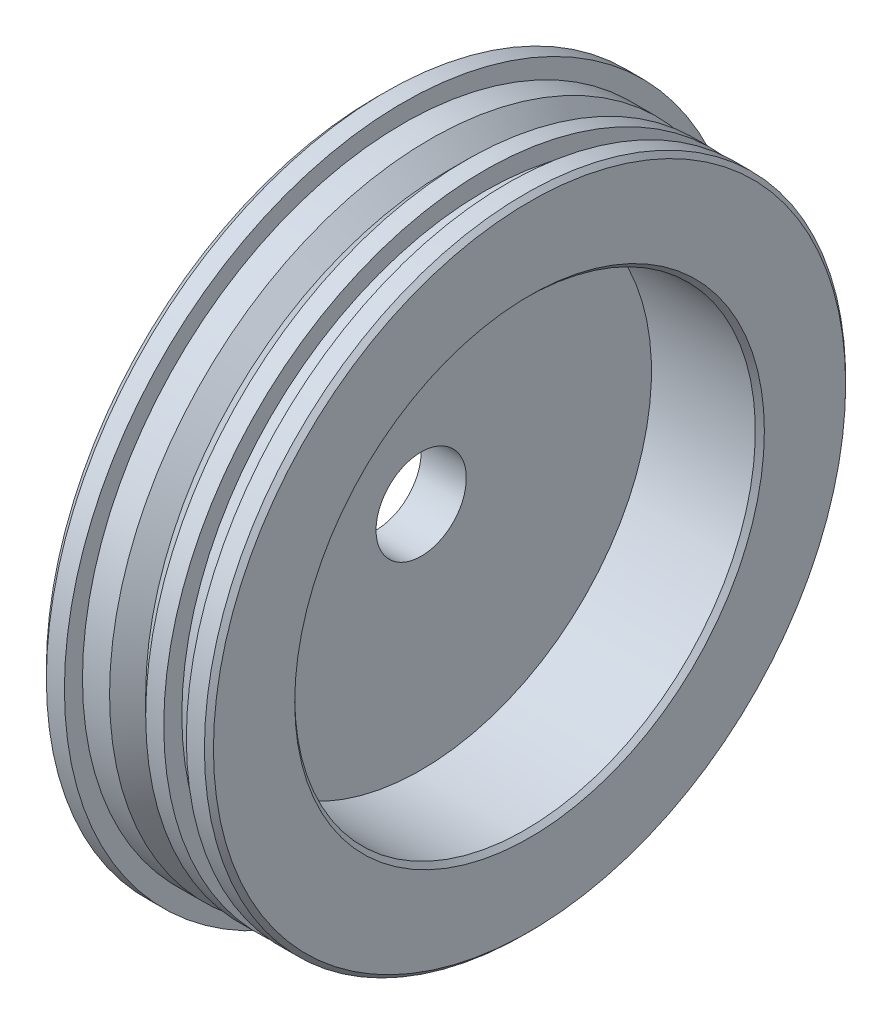
ISO-10303-21;
HEADER;
FILE_DESCRIPTION(('STEP AP214'),'2;1');
FILE_NAME('part.step','',(''),(''),'','','');
FILE_SCHEMA(('AUTOMOTIVE_DESIGN { 1 0 10303 214 1 1 1 1 }'));
ENDSEC;
DATA;
#1=APPLICATION_CONTEXT('core data for automotive mechanical design processes');
#2=APPLICATION_PROTOCOL_DEFINITION('international standard','automotive_design',2000,#1);
#3=PRODUCT_CONTEXT('',#1,'mechanical');
#4=PRODUCT('Part','Part','',(#3));
#5=PRODUCT_RELATED_PRODUCT_CATEGORY('part','',(#4));
#6=PRODUCT_DEFINITION_FORMATION('','',#4);
#7=PRODUCT_DEFINITION_CONTEXT('part definition',#1,'design');
#8=PRODUCT_DEFINITION('design','',#6,#7);
#9=PRODUCT_DEFINITION_SHAPE('','',#8);
#10=(LENGTH_UNIT() NAMED_UNIT(*) SI_UNIT(.MILLI.,.METRE.));
#11=(NAMED_UNIT(*) PLANE_ANGLE_UNIT() SI_UNIT($,.RADIAN.));
#12=(NAMED_UNIT(*) SI_UNIT($,.STERADIAN.) SOLID_ANGLE_UNIT());
#13=UNCERTAINTY_MEASURE_WITH_UNIT(LENGTH_MEASURE(1.E-05),#10,'distance_accuracy_value','');
#14=(GEOMETRIC_REPRESENTATION_CONTEXT(3) GLOBAL_UNCERTAINTY_ASSIGNED_CONTEXT((#13)) GLOBAL_UNIT_ASSIGNED_CONTEXT((#10,
#11,#12)) REPRESENTATION_CONTEXT('',''));
#15=CARTESIAN_POINT('',(0.,0.,0.));
#16=DIRECTION('',(0.,0.,1.));
#17=DIRECTION('',(1.,0.,0.));
#18=AXIS2_PLACEMENT_3D('',#15,#16,#17);
#19=CARTESIAN_POINT('',(-5.,0.,0.));
#20=DIRECTION('',(1.,0.,0.));
#21=DIRECTION('',(0.,0.,-1.));
#22=AXIS2_PLACEMENT_3D('',#19,#20,#21);
#23=PLANE('',#22);
#24=CARTESIAN_POINT('',(-5.,0.,0.));
#25=DIRECTION('',(-1.,0.,0.));
#26=DIRECTION('',(0.,0.,1.));
#27=AXIS2_PLACEMENT_3D('',#24,#25,#26);
#28=CIRCLE('',#27,5.);
#29=CARTESIAN_POINT('',(-5.,0.,5.));
#30=VERTEX_POINT('',#29);
#31=EDGE_CURVE('E92',#30,#30,#28,.T.);
#32=ORIENTED_EDGE('',*,*,#31,.F.);
#33=EDGE_LOOP('',(#32));
#34=FACE_BOUND('',#33,.T.);
#35=CARTESIAN_POINT('',(-5.,0.,0.));
#36=DIRECTION('',(-1.,0.,0.));
#37=DIRECTION('',(0.,0.,1.));
#38=AXIS2_PLACEMENT_3D('',#35,#36,#37);
#39=CIRCLE('',#38,36.5);
#40=CARTESIAN_POINT('',(-5.,0.,36.5));
#41=VERTEX_POINT('',#40);
#42=EDGE_CURVE('E10',#41,#41,#39,.T.);
#43=ORIENTED_EDGE('',*,*,#42,.T.);
#44=EDGE_LOOP('',(#43));
#45=FACE_BOUND('',#44,.T.);
#46=ADVANCED_FACE('F37',(#34,#45),#23,.F.);
#47=CARTESIAN_POINT('',(-4.,0.,0.));
#48=DIRECTION('',(1.,0.,0.));
#49=DIRECTION('',(0.,0.,-1.));
#50=AXIS2_PLACEMENT_3D('',#47,#48,#49);
#51=CONICAL_SURFACE('',#50,37.5,0.785398163397449);
#52=ORIENTED_EDGE('',*,*,#42,.F.);
#53=EDGE_LOOP('',(#52));
#54=FACE_BOUND('',#53,.T.);
#55=CARTESIAN_POINT('',(-4.,0.,0.));
#56=DIRECTION('',(-1.,0.,0.));
#57=DIRECTION('',(0.,0.,1.));
#58=AXIS2_PLACEMENT_3D('',#55,#56,#57);
#59=CIRCLE('',#58,37.5);
#60=CARTESIAN_POINT('',(-4.,0.,37.5));
#61=VERTEX_POINT('',#60);
#62=EDGE_CURVE('E44',#61,#61,#59,.T.);
#63=ORIENTED_EDGE('',*,*,#62,.T.);
#64=EDGE_LOOP('',(#63));
#65=FACE_BOUND('',#64,.T.);
#66=ADVANCED_FACE('F111',(#54,#65),#51,.T.);
#67=CARTESIAN_POINT('',(0.,0.,0.));
#68=DIRECTION('',(-1.,0.,0.));
#69=DIRECTION('',(0.,0.,1.));
#70=AXIS2_PLACEMENT_3D('',#67,#68,#69);
#71=CYLINDRICAL_SURFACE('',#70,37.5);
#72=ORIENTED_EDGE('',*,*,#62,.F.);
#73=EDGE_LOOP('',(#72));
#74=FACE_BOUND('',#73,.T.);
#75=CARTESIAN_POINT('',(-2.,0.,0.));
#76=DIRECTION('',(-1.,0.,0.));
#77=DIRECTION('',(0.,0.,1.));
#78=AXIS2_PLACEMENT_3D('',#75,#76,#77);
#79=CIRCLE('',#78,37.5);
#80=CARTESIAN_POINT('',(-2.,0.,37.5));
#81=VERTEX_POINT('',#80);
#82=EDGE_CURVE('E48',#81,#81,#79,.T.);
#83=ORIENTED_EDGE('',*,*,#82,.T.);
#84=EDGE_LOOP('',(#83));
#85=FACE_BOUND('',#84,.T.);
#86=ADVANCED_FACE('F116',(#74,#85),#71,.T.);
#87=CARTESIAN_POINT('',(-2.,37.5,0.));
#88=DIRECTION('',(-1.,0.,0.));
#89=DIRECTION('',(0.,0.,1.));
#90=AXIS2_PLACEMENT_3D('',#87,#88,#89);
#91=PLANE('',#90);
#92=ORIENTED_EDGE('',*,*,#82,.F.);
#93=EDGE_LOOP('',(#92));
#94=FACE_BOUND('',#93,.T.);
#95=CARTESIAN_POINT('',(-2.,0.,0.));
#96=DIRECTION('',(-1.,0.,0.));
#97=DIRECTION('',(0.,0.,1.));
#98=AXIS2_PLACEMENT_3D('',#95,#96,#97);
#99=CIRCLE('',#98,35.5);
#100=CARTESIAN_POINT('',(-2.,0.,35.5));
#101=VERTEX_POINT('',#100);
#102=EDGE_CURVE('E53',#101,#101,#99,.T.);
#103=ORIENTED_EDGE('',*,*,#102,.T.);
#104=EDGE_LOOP('',(#103));
#105=FACE_BOUND('',#104,.T.);
#106=ADVANCED_FACE('F121',(#94,#105),#91,.F.);
#107=CARTESIAN_POINT('',(0.,0.,0.));
#108=DIRECTION('',(-1.,0.,0.));
#109=DIRECTION('',(0.,0.,1.));
#110=AXIS2_PLACEMENT_3D('',#107,#108,#109);
#111=CYLINDRICAL_SURFACE('',#110,35.5);
#112=ORIENTED_EDGE('',*,*,#102,.F.);
#113=EDGE_LOOP('',(#112));
#114=FACE_BOUND('',#113,.T.);
#115=CARTESIAN_POINT('',(1.00000000000001,0.,0.));
#116=DIRECTION('',(-1.,0.,0.));
#117=DIRECTION('',(0.,0.,1.));
#118=AXIS2_PLACEMENT_3D('',#115,#116,#117);
#119=CIRCLE('',#118,35.5);
#120=CARTESIAN_POINT('',(1.00000000000001,0.,35.5));
#121=VERTEX_POINT('',#120);
#122=EDGE_CURVE('E56',#121,#121,#119,.T.);
#123=ORIENTED_EDGE('',*,*,#122,.T.);
#124=EDGE_LOOP('',(#123));
#125=FACE_BOUND('',#124,.T.);
#126=ADVANCED_FACE('F128',(#114,#125),#111,.T.);
#127=CARTESIAN_POINT('',(3.,0.,0.));
#128=DIRECTION('',(-1.,0.,0.));
#129=DIRECTION('',(0.,0.,1.));
#130=AXIS2_PLACEMENT_3D('',#127,#128,#129);
#131=CONICAL_SURFACE('',#130,33.5,0.785398163397451);
#132=ORIENTED_EDGE('',*,*,#122,.F.);
#133=EDGE_LOOP('',(#132));
#134=FACE_BOUND('',#133,.T.);
#135=CARTESIAN_POINT('',(3.,0.,0.));
#136=DIRECTION('',(-1.,0.,0.));
#137=DIRECTION('',(0.,0.,1.));
#138=AXIS2_PLACEMENT_3D('',#135,#136,#137);
#139=CIRCLE('',#138,33.5);
#140=CARTESIAN_POINT('',(3.,0.,33.5));
#141=VERTEX_POINT('',#140);
#142=EDGE_CURVE('E59',#141,#141,#139,.T.);
#143=ORIENTED_EDGE('',*,*,#142,.T.);
#144=EDGE_LOOP('',(#143));
#145=FACE_BOUND('',#144,.T.);
#146=ADVANCED_FACE('F132',(#134,#145),#131,.T.);
#147=CARTESIAN_POINT('',(5.00000000000001,0.,0.));
#148=DIRECTION('',(1.,0.,0.));
#149=DIRECTION('',(0.,0.,-1.));
#150=AXIS2_PLACEMENT_3D('',#147,#148,#149);
#151=CONICAL_SURFACE('',#150,35.5,0.785398163397446);
#152=ORIENTED_EDGE('',*,*,#142,.F.);
#153=EDGE_LOOP('',(#152));
#154=FACE_BOUND('',#153,.T.);
#155=CARTESIAN_POINT('',(5.00000000000001,0.,0.));
#156=DIRECTION('',(-1.,0.,0.));
#157=DIRECTION('',(0.,0.,1.));
#158=AXIS2_PLACEMENT_3D('',#155,#156,#157);
#159=CIRCLE('',#158,35.5);
#160=CARTESIAN_POINT('',(5.00000000000001,0.,35.5));
#161=VERTEX_POINT('',#160);
#162=EDGE_CURVE('E62',#161,#161,#159,.T.);
#163=ORIENTED_EDGE('',*,*,#162,.T.);
#164=EDGE_LOOP('',(#163));
#165=FACE_BOUND('',#164,.T.);
#166=ADVANCED_FACE('F136',(#154,#165),#151,.T.);
#167=CARTESIAN_POINT('',(0.,0.,0.));
#168=DIRECTION('',(-1.,0.,0.));
#169=DIRECTION('',(0.,0.,1.));
#170=AXIS2_PLACEMENT_3D('',#167,#168,#169);
#171=CYLINDRICAL_SURFACE('',#170,35.5);
#172=ORIENTED_EDGE('',*,*,#162,.F.);
#173=EDGE_LOOP('',(#172));
#174=FACE_BOUND('',#173,.T.);
#175=CARTESIAN_POINT('',(7.00000000000001,0.,0.));
#176=DIRECTION('',(-1.,0.,0.));
#177=DIRECTION('',(0.,0.,1.));
#178=AXIS2_PLACEMENT_3D('',#175,#176,#177);
#179=CIRCLE('',#178,35.5);
#180=CARTESIAN_POINT('',(7.00000000000001,0.,35.5));
#181=VERTEX_POINT('',#180);
#182=EDGE_CURVE('E65',#181,#181,#179,.T.);
#183=ORIENTED_EDGE('',*,*,#182,.T.);
#184=EDGE_LOOP('',(#183));
#185=FACE_BOUND('',#184,.T.);
#186=ADVANCED_FACE('F140',(#174,#185),#171,.T.);
#187=CARTESIAN_POINT('',(7.00000000000001,35.5,0.));
#188=DIRECTION('',(-1.,0.,0.));
#189=DIRECTION('',(0.,0.,1.));
#190=AXIS2_PLACEMENT_3D('',#187,#188,#189);
#191=PLANE('',#190);
#192=ORIENTED_EDGE('',*,*,#182,.F.);
#193=EDGE_LOOP('',(#192));
#194=FACE_BOUND('',#193,.T.);
#195=CARTESIAN_POINT('',(7.00000000000001,0.,0.));
#196=DIRECTION('',(-1.,0.,0.));
#197=DIRECTION('',(0.,0.,1.));
#198=AXIS2_PLACEMENT_3D('',#195,#196,#197);
#199=CIRCLE('',#198,33.5);
#200=CARTESIAN_POINT('',(7.00000000000001,0.,33.5));
#201=VERTEX_POINT('',#200);
#202=EDGE_CURVE('E68',#201,#201,#199,.T.);
#203=ORIENTED_EDGE('',*,*,#202,.T.);
#204=EDGE_LOOP('',(#203));
#205=FACE_BOUND('',#204,.T.);
#206=ADVANCED_FACE('F144',(#194,#205),#191,.F.);
#207=CARTESIAN_POINT('',(0.,0.,0.));
#208=DIRECTION('',(-1.,0.,0.));
#209=DIRECTION('',(0.,0.,1.));
#210=AXIS2_PLACEMENT_3D('',#207,#208,#209);
#211=CYLINDRICAL_SURFACE('',#210,33.5);
#212=ORIENTED_EDGE('',*,*,#202,.F.);
#213=EDGE_LOOP('',(#212));
#214=FACE_BOUND('',#213,.T.);
#215=CARTESIAN_POINT('',(9.50000000000001,0.,0.));
#216=DIRECTION('',(-1.,0.,0.));
#217=DIRECTION('',(0.,0.,1.));
#218=AXIS2_PLACEMENT_3D('',#215,#216,#217);
#219=CIRCLE('',#218,33.5);
#220=CARTESIAN_POINT('',(9.50000000000001,0.,33.5));
#221=VERTEX_POINT('',#220);
#222=EDGE_CURVE('E71',#221,#221,#219,.T.);
#223=ORIENTED_EDGE('',*,*,#222,.T.);
#224=EDGE_LOOP('',(#223));
#225=FACE_BOUND('',#224,.T.);
#226=ADVANCED_FACE('F148',(#214,#225),#211,.T.);
#227=CARTESIAN_POINT('',(9.50000000000001,33.5,0.));
#228=DIRECTION('',(1.,0.,0.));
#229=DIRECTION('',(0.,0.,-1.));
#230=AXIS2_PLACEMENT_3D('',#227,#228,#229);
#231=PLANE('',#230);
#232=ORIENTED_EDGE('',*,*,#222,.F.);
#233=EDGE_LOOP('',(#232));
#234=FACE_BOUND('',#233,.T.);
#235=CARTESIAN_POINT('',(9.50000000000001,0.,0.));
#236=DIRECTION('',(-1.,0.,0.));
#237=DIRECTION('',(0.,0.,1.));
#238=AXIS2_PLACEMENT_3D('',#235,#236,#237);
#239=CIRCLE('',#238,35.5);
#240=CARTESIAN_POINT('',(9.50000000000001,0.,35.5));
#241=VERTEX_POINT('',#240);
#242=EDGE_CURVE('E74',#241,#241,#239,.T.);
#243=ORIENTED_EDGE('',*,*,#242,.T.);
#244=EDGE_LOOP('',(#243));
#245=FACE_BOUND('',#244,.T.);
#246=ADVANCED_FACE('F152',(#234,#245),#231,.F.);
#247=CARTESIAN_POINT('',(0.,0.,0.));
#248=DIRECTION('',(-1.,0.,0.));
#249=DIRECTION('',(0.,0.,1.));
#250=AXIS2_PLACEMENT_3D('',#247,#248,#249);
#251=CYLINDRICAL_SURFACE('',#250,35.5);
#252=ORIENTED_EDGE('',*,*,#242,.F.);
#253=EDGE_LOOP('',(#252));
#254=FACE_BOUND('',#253,.T.);
#255=CARTESIAN_POINT('',(11.5,0.,0.));
#256=DIRECTION('',(-1.,0.,0.));
#257=DIRECTION('',(0.,0.,1.));
#258=AXIS2_PLACEMENT_3D('',#255,#256,#257);
#259=CIRCLE('',#258,35.5);
#260=CARTESIAN_POINT('',(11.5,0.,35.5));
#261=VERTEX_POINT('',#260);
#262=EDGE_CURVE('E77',#261,#261,#259,.T.);
#263=ORIENTED_EDGE('',*,*,#262,.T.);
#264=EDGE_LOOP('',(#263));
#265=FACE_BOUND('',#264,.T.);
#266=ADVANCED_FACE('F156',(#254,#265),#251,.T.);
#267=CARTESIAN_POINT('',(12.,0.,0.));
#268=DIRECTION('',(-1.,0.,0.));
#269=DIRECTION('',(0.,0.,1.));
#270=AXIS2_PLACEMENT_3D('',#267,#268,#269);
#271=CONICAL_SURFACE('',#270,35.,0.785398163397447);
#272=ORIENTED_EDGE('',*,*,#262,.F.);
#273=EDGE_LOOP('',(#272));
#274=FACE_BOUND('',#273,.T.);
#275=CARTESIAN_POINT('',(12.,0.,0.));
#276=DIRECTION('',(-1.,0.,0.));
#277=DIRECTION('',(0.,0.,1.));
#278=AXIS2_PLACEMENT_3D('',#275,#276,#277);
#279=CIRCLE('',#278,35.);
#280=CARTESIAN_POINT('',(12.,0.,35.));
#281=VERTEX_POINT('',#280);
#282=EDGE_CURVE('E80',#281,#281,#279,.T.);
#283=ORIENTED_EDGE('',*,*,#282,.T.);
#284=EDGE_LOOP('',(#283));
#285=FACE_BOUND('',#284,.T.);
#286=ADVANCED_FACE('F160',(#274,#285),#271,.T.);
#287=CARTESIAN_POINT('',(12.,35.,0.));
#288=DIRECTION('',(-1.,0.,0.));
#289=DIRECTION('',(0.,0.,1.));
#290=AXIS2_PLACEMENT_3D('',#287,#288,#289);
#291=PLANE('',#290);
#292=ORIENTED_EDGE('',*,*,#282,.F.);
#293=EDGE_LOOP('',(#292));
#294=FACE_BOUND('',#293,.T.);
#295=CARTESIAN_POINT('',(12.,0.,0.));
#296=DIRECTION('',(-1.,0.,0.));
#297=DIRECTION('',(0.,0.,1.));
#298=AXIS2_PLACEMENT_3D('',#295,#296,#297);
#299=CIRCLE('',#298,26.);
#300=CARTESIAN_POINT('',(12.,0.,26.));
#301=VERTEX_POINT('',#300);
#302=EDGE_CURVE('E83',#301,#301,#299,.T.);
#303=ORIENTED_EDGE('',*,*,#302,.T.);
#304=EDGE_LOOP('',(#303));
#305=FACE_BOUND('',#304,.T.);
#306=ADVANCED_FACE('F164',(#294,#305),#291,.F.);
#307=CARTESIAN_POINT('',(11.5,0.,0.));
#308=DIRECTION('',(1.,0.,0.));
#309=DIRECTION('',(0.,0.,-1.));
#310=AXIS2_PLACEMENT_3D('',#307,#308,#309);
#311=CONICAL_SURFACE('',#310,25.5,0.78539816339745);
#312=ORIENTED_EDGE('',*,*,#302,.F.);
#313=EDGE_LOOP('',(#312));
#314=FACE_BOUND('',#313,.T.);
#315=CARTESIAN_POINT('',(11.5,0.,0.));
#316=DIRECTION('',(-1.,0.,0.));
#317=DIRECTION('',(0.,0.,1.));
#318=AXIS2_PLACEMENT_3D('',#315,#316,#317);
#319=CIRCLE('',#318,25.5);
#320=CARTESIAN_POINT('',(11.5,0.,25.5));
#321=VERTEX_POINT('',#320);
#322=EDGE_CURVE('E86',#321,#321,#319,.T.);
#323=ORIENTED_EDGE('',*,*,#322,.T.);
#324=EDGE_LOOP('',(#323));
#325=FACE_BOUND('',#324,.T.);
#326=ADVANCED_FACE('F168',(#314,#325),#311,.F.);
#327=CARTESIAN_POINT('',(0.,0.,0.));
#328=DIRECTION('',(-1.,0.,0.));
#329=DIRECTION('',(0.,0.,1.));
#330=AXIS2_PLACEMENT_3D('',#327,#328,#329);
#331=CYLINDRICAL_SURFACE('',#330,25.5);
#332=ORIENTED_EDGE('',*,*,#322,.F.);
#333=EDGE_LOOP('',(#332));
#334=FACE_BOUND('',#333,.T.);
#335=CARTESIAN_POINT('',(0.,0.,0.));
#336=DIRECTION('',(-1.,0.,0.));
#337=DIRECTION('',(0.,0.,1.));
#338=AXIS2_PLACEMENT_3D('',#335,#336,#337);
#339=CIRCLE('',#338,25.5);
#340=CARTESIAN_POINT('',(0.,0.,25.5));
#341=VERTEX_POINT('',#340);
#342=EDGE_CURVE('E89',#341,#341,#339,.T.);
#343=ORIENTED_EDGE('',*,*,#342,.T.);
#344=EDGE_LOOP('',(#343));
#345=FACE_BOUND('',#344,.T.);
#346=ADVANCED_FACE('F108',(#334,#345),#331,.F.);
#347=CARTESIAN_POINT('',(0.,25.5,0.));
#348=DIRECTION('',(-1.,0.,0.));
#349=DIRECTION('',(0.,0.,1.));
#350=AXIS2_PLACEMENT_3D('',#347,#348,#349);
#351=PLANE('',#350);
#352=CARTESIAN_POINT('',(0.,0.,0.));
#353=DIRECTION('',(-1.,0.,0.));
#354=DIRECTION('',(0.,0.,1.));
#355=AXIS2_PLACEMENT_3D('',#352,#353,#354);
#356=CIRCLE('',#355,5.);
#357=CARTESIAN_POINT('',(0.,0.,5.));
#358=VERTEX_POINT('',#357);
#359=EDGE_CURVE('E40',#358,#358,#356,.T.);
#360=ORIENTED_EDGE('',*,*,#359,.T.);
#361=EDGE_LOOP('',(#360));
#362=FACE_BOUND('',#361,.T.);
#363=ORIENTED_EDGE('',*,*,#342,.F.);
#364=EDGE_LOOP('',(#363));
#365=FACE_BOUND('',#364,.T.);
#366=ADVANCED_FACE('F99',(#362,#365),#351,.F.);
#367=CARTESIAN_POINT('',(5.,0.,0.));
#368=DIRECTION('',(-1.,0.,0.));
#369=DIRECTION('',(0.,0.,1.));
#370=AXIS2_PLACEMENT_3D('',#367,#368,#369);
#371=CYLINDRICAL_SURFACE('',#370,5.);
#372=ORIENTED_EDGE('',*,*,#31,.T.);
#373=EDGE_LOOP('',(#372));
#374=FACE_BOUND('',#373,.T.);
#375=ORIENTED_EDGE('',*,*,#359,.F.);
#376=EDGE_LOOP('',(#375));
#377=FACE_BOUND('',#376,.T.);
#378=ADVANCED_FACE('F102',(#374,#377),#371,.F.);
#379=CLOSED_SHELL('',(#46,#66,#86,#106,#126,#146,#166,#186,#206,#226,#246,#266,#286,#306,#326,
#346,#366,#378));
#380=MANIFOLD_SOLID_BREP('B2',#379);
#381=ADVANCED_BREP_SHAPE_REPRESENTATION('',(#18,#380),#14);
#382=SHAPE_DEFINITION_REPRESENTATION(#9,#381);
ENDSEC;
END-ISO-10303-21;
